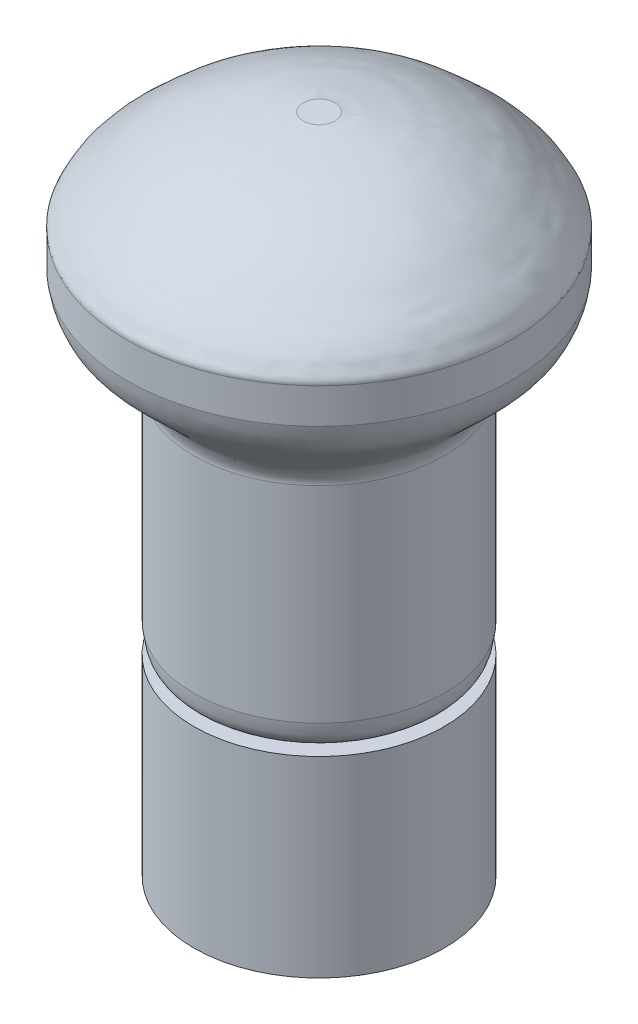
ISO-10303-21;
HEADER;
FILE_DESCRIPTION(('STEP AP214'),'2;1');
FILE_NAME('part.step','',(''),(''),'','','');
FILE_SCHEMA(('AUTOMOTIVE_DESIGN { 1 0 10303 214 1 1 1 1 }'));
ENDSEC;
DATA;
#1=APPLICATION_CONTEXT('core data for automotive mechanical design processes');
#2=APPLICATION_PROTOCOL_DEFINITION('international standard','automotive_design',2000,#1);
#3=PRODUCT_CONTEXT('',#1,'mechanical');
#4=PRODUCT('Part','Part','',(#3));
#5=PRODUCT_RELATED_PRODUCT_CATEGORY('part','',(#4));
#6=PRODUCT_DEFINITION_FORMATION('','',#4);
#7=PRODUCT_DEFINITION_CONTEXT('part definition',#1,'design');
#8=PRODUCT_DEFINITION('design','',#6,#7);
#9=PRODUCT_DEFINITION_SHAPE('','',#8);
#10=(LENGTH_UNIT() NAMED_UNIT(*) SI_UNIT(.MILLI.,.METRE.));
#11=(NAMED_UNIT(*) PLANE_ANGLE_UNIT() SI_UNIT($,.RADIAN.));
#12=(NAMED_UNIT(*) SI_UNIT($,.STERADIAN.) SOLID_ANGLE_UNIT());
#13=UNCERTAINTY_MEASURE_WITH_UNIT(LENGTH_MEASURE(1.E-05),#10,'distance_accuracy_value','');
#14=(GEOMETRIC_REPRESENTATION_CONTEXT(3) GLOBAL_UNCERTAINTY_ASSIGNED_CONTEXT((#13)) GLOBAL_UNIT_ASSIGNED_CONTEXT((#10,
#11,#12)) REPRESENTATION_CONTEXT('',''));
#15=CARTESIAN_POINT('',(0.,0.,0.));
#16=DIRECTION('',(0.,0.,1.));
#17=DIRECTION('',(1.,0.,0.));
#18=AXIS2_PLACEMENT_3D('',#15,#16,#17);
#19=CARTESIAN_POINT('',(0.,274.97797815188,-26.0877562004189));
#20=CARTESIAN_POINT('',(0.,275.85671053562,-26.008069584367));
#21=CARTESIAN_POINT('',(0.,277.028730659966,-26.4968306616538));
#22=CARTESIAN_POINT('',(0.,278.556908895579,-27.143781616818));
#23=CARTESIAN_POINT('',(0.,279.511909602148,-28.0566998106422));
#24=CARTESIAN_POINT('',(0.,280.515150439003,-28.8604144206132));
#25=CARTESIAN_POINT('',(0.,281.464372876021,-29.8741822057865));
#26=CARTESIAN_POINT('',(0.,282.438718877527,-30.7668156666122));
#27=CARTESIAN_POINT('',(0.,283.286750944215,-31.8701319484381));
#28=CARTESIAN_POINT('',(0.,284.296585872149,-32.8232553683531));
#29=CARTESIAN_POINT('',(0.,285.346264323249,-33.8310623741313));
#30=CARTESIAN_POINT('',(0.,286.251458488581,-34.9740473057541));
#31=CARTESIAN_POINT('',(0.,287.265101849722,-35.9232084666643));
#32=CARTESIAN_POINT('',(0.,288.227943295312,-36.9195004345893));
#33=CARTESIAN_POINT('',(0.,289.239215664027,-37.8417550182629));
#34=CARTESIAN_POINT('',(0.,290.459886772489,-38.6018552910868));
#35=CARTESIAN_POINT('',(0.,291.690071061629,-39.1094769201823));
#36=CARTESIAN_POINT('',(0.,293.368854610872,-39.7868935513682));
#37=CARTESIAN_POINT('',(0.,294.713139617419,-39.9635855751277));
#38=CARTESIAN_POINT('',(0.,295.618823673656,-40.1350010667897));
#39=B_SPLINE_CURVE_WITH_KNOTS('',3,(#19,#20,#21,#22,#23,#24,#25,#26,#27,#28,#29,#30,#31,#32,#33,
#34,#35,#36,#37,#38),.UNSPECIFIED.,.F.,.F.,(4,1,1,1,1,1,1,1,1,1,1,1,1,1,1,1,1,4),(0.,
0.098162731319244,0.148050319930377,0.191615525816055,0.250907111027677,0.298235650507006,
0.353450737835848,0.404874012400153,0.460091024302986,0.515307654342493,0.57460049280603,
0.629814130030781,0.677144600956594,0.736437803653506,0.789054863646636,0.843990098189885,
0.891644292334275,1.),.UNSPECIFIED.);
#40=CARTESIAN_POINT('',(0.,324.,1.29063426612674E-12));
#41=DIRECTION('',(0.,1.,0.));
#42=AXIS1_PLACEMENT('',#40,#41);
#43=SURFACE_OF_REVOLUTION('',#39,#42);
#44=CARTESIAN_POINT('',(0.,295.618823673656,1.28698734073051E-12));
#45=DIRECTION('',(0.,1.,0.));
#46=DIRECTION('',(0.,0.,1.));
#47=AXIS2_PLACEMENT_3D('',#44,#45,#46);
#48=CIRCLE('',#47,40.135001066791);
#49=CARTESIAN_POINT('',(0.,295.618823673656,40.1350010667923));
#50=VERTEX_POINT('',#49);
#51=EDGE_CURVE('E61',#50,#50,#48,.T.);
#52=ORIENTED_EDGE('',*,*,#51,.F.);
#53=EDGE_LOOP('',(#52));
#54=FACE_BOUND('',#53,.T.);
#55=CARTESIAN_POINT('',(0.,274.97797815188,1.28433503263491E-12));
#56=DIRECTION('',(0.,1.,0.));
#57=DIRECTION('',(0.,0.,1.));
#58=AXIS2_PLACEMENT_3D('',#55,#56,#57);
#59=CIRCLE('',#58,26.0877562004201);
#60=CARTESIAN_POINT('',(0.,274.97797815188,26.0877562004214));
#61=VERTEX_POINT('',#60);
#62=EDGE_CURVE('E10',#61,#61,#59,.T.);
#63=ORIENTED_EDGE('',*,*,#62,.T.);
#64=EDGE_LOOP('',(#63));
#65=FACE_BOUND('',#64,.T.);
#66=ADVANCED_FACE('F32',(#54,#65),#43,.T.);
#67=CARTESIAN_POINT('',(0.,324.,1.29063426612674E-12));
#68=DIRECTION('',(0.,1.,0.));
#69=DIRECTION('',(0.,0.,1.));
#70=AXIS2_PLACEMENT_3D('',#67,#68,#69);
#71=CYLINDRICAL_SURFACE('',#70,26.0877562004201);
#72=ORIENTED_EDGE('',*,*,#62,.F.);
#73=EDGE_LOOP('',(#72));
#74=FACE_BOUND('',#73,.T.);
#75=CARTESIAN_POINT('',(0.,232.119517882356,1.27882780469611E-12));
#76=DIRECTION('',(0.,1.,0.));
#77=DIRECTION('',(0.,0.,1.));
#78=AXIS2_PLACEMENT_3D('',#75,#76,#77);
#79=CIRCLE('',#78,26.0877562004201);
#80=CARTESIAN_POINT('',(0.,232.119517882356,26.0877562004213));
#81=VERTEX_POINT('',#80);
#82=EDGE_CURVE('E39',#81,#81,#79,.T.);
#83=ORIENTED_EDGE('',*,*,#82,.T.);
#84=EDGE_LOOP('',(#83));
#85=FACE_BOUND('',#84,.T.);
#86=ADVANCED_FACE('F79',(#74,#85),#71,.T.);
#87=CARTESIAN_POINT('',(0.,226.099267924578,-21.6442226380291));
#88=CARTESIAN_POINT('',(0.,226.150905548264,-21.9583507807492));
#89=CARTESIAN_POINT('',(0.,226.152975164436,-22.404904397741));
#90=CARTESIAN_POINT('',(0.,226.332084554161,-22.8959588216177));
#91=CARTESIAN_POINT('',(0.,226.749372055139,-23.4400307864732));
#92=CARTESIAN_POINT('',(0.,227.201358343078,-24.2443056301981));
#93=CARTESIAN_POINT('',(0.,227.972439802654,-25.006598671449));
#94=CARTESIAN_POINT('',(0.,228.952220984884,-25.5796050233695));
#95=CARTESIAN_POINT('',(0.,230.393042058328,-25.8622226042477));
#96=CARTESIAN_POINT('',(0.,231.443642051662,-26.0228206402817));
#97=CARTESIAN_POINT('',(0.,232.119517882356,-26.0877562004188));
#98=B_SPLINE_CURVE_WITH_KNOTS('',3,(#87,#88,#89,#90,#91,#92,#93,#94,#95,#96,#97),.UNSPECIFIED.,
.F.,.F.,(4,1,1,1,1,1,1,1,4),(0.,0.0919240044132616,0.112491347202395,0.205673427891337,
0.333713757734475,0.459267324426669,0.602422929602104,0.748839040688865,1.),.UNSPECIFIED.);
#99=CARTESIAN_POINT('',(0.,324.,1.29063426612674E-12));
#100=DIRECTION('',(0.,1.,0.));
#101=AXIS1_PLACEMENT('',#99,#100);
#102=SURFACE_OF_REVOLUTION('',#98,#101);
#103=ORIENTED_EDGE('',*,*,#82,.F.);
#104=EDGE_LOOP('',(#103));
#105=FACE_BOUND('',#104,.T.);
#106=CARTESIAN_POINT('',(0.,226.099267924578,1.27805421440478E-12));
#107=DIRECTION('',(0.,1.,0.));
#108=DIRECTION('',(0.,0.,1.));
#109=AXIS2_PLACEMENT_3D('',#106,#107,#108);
#110=CIRCLE('',#109,21.6442226380304);
#111=CARTESIAN_POINT('',(0.,226.099267924578,21.6442226380317));
#112=VERTEX_POINT('',#111);
#113=EDGE_CURVE('E43',#112,#112,#110,.T.);
#114=ORIENTED_EDGE('',*,*,#113,.T.);
#115=EDGE_LOOP('',(#114));
#116=FACE_BOUND('',#115,.T.);
#117=ADVANCED_FACE('F75',(#105,#116),#102,.T.);
#118=CARTESIAN_POINT('',(0.,226.099267924578,-21.6442226380291));
#119=DIRECTION('',(0.,-1.,0.));
#120=DIRECTION('',(0.,0.,-1.));
#121=AXIS2_PLACEMENT_3D('',#118,#119,#120);
#122=PLANE('',#121);
#123=ORIENTED_EDGE('',*,*,#113,.F.);
#124=EDGE_LOOP('',(#123));
#125=FACE_BOUND('',#124,.T.);
#126=CARTESIAN_POINT('',(0.,226.099267924578,1.27805421440478E-12));
#127=DIRECTION('',(0.,1.,0.));
#128=DIRECTION('',(0.,0.,1.));
#129=AXIS2_PLACEMENT_3D('',#126,#127,#128);
#130=CIRCLE('',#129,26.0877562004201);
#131=CARTESIAN_POINT('',(0.,226.099267924578,26.0877562004214));
#132=VERTEX_POINT('',#131);
#133=EDGE_CURVE('E47',#132,#132,#130,.T.);
#134=ORIENTED_EDGE('',*,*,#133,.T.);
#135=EDGE_LOOP('',(#134));
#136=FACE_BOUND('',#135,.T.);
#137=ADVANCED_FACE('F78',(#125,#136),#122,.F.);
#138=CARTESIAN_POINT('',(0.,324.,1.29063426612674E-12));
#139=DIRECTION('',(0.,1.,0.));
#140=DIRECTION('',(0.,0.,1.));
#141=AXIS2_PLACEMENT_3D('',#138,#139,#140);
#142=CYLINDRICAL_SURFACE('',#141,26.0877562004201);
#143=ORIENTED_EDGE('',*,*,#133,.F.);
#144=EDGE_LOOP('',(#143));
#145=FACE_BOUND('',#144,.T.);
#146=CARTESIAN_POINT('',(0.,186.115239509348,1.27291634531174E-12));
#147=DIRECTION('',(0.,1.,0.));
#148=DIRECTION('',(0.,0.,1.));
#149=AXIS2_PLACEMENT_3D('',#146,#147,#148);
#150=CIRCLE('',#149,26.0877562004202);
#151=CARTESIAN_POINT('',(0.,186.115239509348,26.0877562004215));
#152=VERTEX_POINT('',#151);
#153=EDGE_CURVE('E52',#152,#152,#150,.T.);
#154=ORIENTED_EDGE('',*,*,#153,.T.);
#155=EDGE_LOOP('',(#154));
#156=FACE_BOUND('',#155,.T.);
#157=ADVANCED_FACE('F110',(#145,#156),#142,.T.);
#158=CARTESIAN_POINT('',(0.,186.115239509348,-26.0877562004189));
#159=DIRECTION('',(0.,1.,0.));
#160=DIRECTION('',(0.,0.,1.));
#161=AXIS2_PLACEMENT_3D('',#158,#159,#160);
#162=PLANE('',#161);
#163=ORIENTED_EDGE('',*,*,#153,.F.);
#164=EDGE_LOOP('',(#163));
#165=FACE_BOUND('',#164,.T.);
#166=ADVANCED_FACE('F107',(#165),#162,.F.);
#167=CARTESIAN_POINT('',(0.,324.000000663065,1.29063426621195E-12));
#168=DIRECTION('',(0.,-1.,0.));
#169=DIRECTION('',(0.,0.,-1.));
#170=AXIS2_PLACEMENT_3D('',#167,#168,#169);
#171=PLANE('',#170);
#172=CARTESIAN_POINT('',(0.,324.00000132613,1.29063426629715E-12));
#173=DIRECTION('',(0.,1.,0.));
#174=DIRECTION('',(0.,0.,1.));
#175=AXIS2_PLACEMENT_3D('',#172,#173,#174);
#176=CIRCLE('',#175,3.29680710935418);
#177=CARTESIAN_POINT('',(0.,324.00000132613,3.29680710935547));
#178=VERTEX_POINT('',#177);
#179=EDGE_CURVE('E55',#178,#178,#176,.T.);
#180=ORIENTED_EDGE('',*,*,#179,.T.);
#181=EDGE_LOOP('',(#180));
#182=FACE_BOUND('',#181,.T.);
#183=ADVANCED_FACE('F100',(#182),#171,.F.);
#184=CARTESIAN_POINT('',(0.,302.929125624309,-40.1350010667897));
#185=CARTESIAN_POINT('',(0.,303.734041187309,-40.2773731158294));
#186=CARTESIAN_POINT('',(0.,304.634911320729,-39.472447783729));
#187=CARTESIAN_POINT('',(0.,306.096129676233,-38.9048173101565));
#188=CARTESIAN_POINT('',(0.,307.123784157933,-38.1232721170399));
#189=CARTESIAN_POINT('',(0.,308.020839773503,-37.2941898053905));
#190=CARTESIAN_POINT('',(0.,309.094911082276,-36.507817893929));
#191=CARTESIAN_POINT('',(0.,309.886673636216,-35.3895375288614));
#192=CARTESIAN_POINT('',(0.,310.964611829062,-34.4538834764471));
#193=CARTESIAN_POINT('',(0.,311.850348536143,-33.3377919178896));
#194=CARTESIAN_POINT('',(0.,312.858119022295,-32.1959384791973));
#195=CARTESIAN_POINT('',(0.,313.930025749134,-31.0579698322153));
#196=CARTESIAN_POINT('',(0.,314.893883423043,-29.732159343708));
#197=CARTESIAN_POINT('',(0.,315.783230305052,-28.4317929523757));
#198=CARTESIAN_POINT('',(0.,316.751797909452,-27.1065577612186));
#199=CARTESIAN_POINT('',(0.,317.351842670149,-25.6762035426409));
#200=CARTESIAN_POINT('',(0.,318.116319480558,-24.4370956134543));
#201=CARTESIAN_POINT('',(0.,318.685639731566,-23.2155889953771));
#202=CARTESIAN_POINT('',(0.,319.262699901517,-22.140955466625));
#203=CARTESIAN_POINT('',(0.,319.694847200565,-21.0685887714425));
#204=CARTESIAN_POINT('',(0.,320.193493736991,-19.9309751225669));
#205=CARTESIAN_POINT('',(0.,320.641634269685,-18.8379169628178));
#206=CARTESIAN_POINT('',(0.,321.014944924373,-17.7338670667982));
#207=CARTESIAN_POINT('',(0.,321.249118960795,-16.8100082151483));
#208=CARTESIAN_POINT('',(0.,321.566233217262,-15.9114961193784));
#209=CARTESIAN_POINT('',(0.,321.911666772491,-14.8643430011066));
#210=CARTESIAN_POINT('',(0.,322.313021033603,-13.6371518456722));
#211=CARTESIAN_POINT('',(0.,322.557718534826,-12.1816326643064));
#212=CARTESIAN_POINT('',(0.,322.853770709844,-10.7506907556199));
#213=CARTESIAN_POINT('',(0.,323.156322342493,-9.27221547863258));
#214=CARTESIAN_POINT('',(0.,323.429691692967,-7.69349690876678));
#215=CARTESIAN_POINT('',(0.,323.815957426679,-5.69903077234635));
#216=CARTESIAN_POINT('',(0.,323.839631010621,-4.19716953330026));
#217=CARTESIAN_POINT('',(0.,324.00000132613,-3.29680710935289));
#218=B_SPLINE_CURVE_WITH_KNOTS('',3,(#184,#185,#186,#187,#188,#189,#190,#191,#192,#193,#194,
#195,#196,#197,#198,#199,#200,#201,#202,#203,#204,#205,#206,#207,#208,#209,#210,#211,#212,#213,
#214,#215,#216,#217),.UNSPECIFIED.,.F.,.F.,(4,1,1,1,1,1,1,1,1,1,1,1,1,1,1,1,1,1,1,1,1,1,1,1,1,1,
1,1,1,1,1,4),(0.,0.0487759562585639,0.0776052481053953,0.105330341983679,0.135047076566176,
0.160217455939016,0.194481426274449,0.226388462837515,0.256102501737517,0.290364764351959,
0.329176232590418,0.361406883366528,0.400749846443287,0.435612620367223,0.471646405133775,
0.504831922599108,0.533660456723952,0.562486271670573,0.587035304192654,0.611577475715011,
0.646293700828938,0.666681105004421,0.69014175443044,0.710527470444541,0.730911710659771,
0.764562227724847,0.797431048522779,0.830299831268158,0.863169263467409,0.899205065983318,
0.938415133837604,1.),.UNSPECIFIED.);
#219=CARTESIAN_POINT('',(0.,324.,1.29063426612674E-12));
#220=DIRECTION('',(0.,1.,0.));
#221=AXIS1_PLACEMENT('',#219,#220);
#222=SURFACE_OF_REVOLUTION('',#218,#221);
#223=ORIENTED_EDGE('',*,*,#179,.F.);
#224=EDGE_LOOP('',(#223));
#225=FACE_BOUND('',#224,.T.);
#226=CARTESIAN_POINT('',(0.,302.929125624309,1.28792670016831E-12));
#227=DIRECTION('',(0.,1.,0.));
#228=DIRECTION('',(0.,0.,1.));
#229=AXIS2_PLACEMENT_3D('',#226,#227,#228);
#230=CIRCLE('',#229,40.135001066791);
#231=CARTESIAN_POINT('',(0.,302.929125624309,40.1350010667923));
#232=VERTEX_POINT('',#231);
#233=EDGE_CURVE('E58',#232,#232,#230,.T.);
#234=ORIENTED_EDGE('',*,*,#233,.T.);
#235=EDGE_LOOP('',(#234));
#236=FACE_BOUND('',#235,.T.);
#237=ADVANCED_FACE('F94',(#225,#236),#222,.T.);
#238=CARTESIAN_POINT('',(0.,324.,1.29063426612674E-12));
#239=DIRECTION('',(0.,1.,0.));
#240=DIRECTION('',(0.,0.,1.));
#241=AXIS2_PLACEMENT_3D('',#238,#239,#240);
#242=CYLINDRICAL_SURFACE('',#241,40.135001066791);
#243=ORIENTED_EDGE('',*,*,#233,.F.);
#244=EDGE_LOOP('',(#243));
#245=FACE_BOUND('',#244,.T.);
#246=ORIENTED_EDGE('',*,*,#51,.T.);
#247=EDGE_LOOP('',(#246));
#248=FACE_BOUND('',#247,.T.);
#249=ADVANCED_FACE('F92',(#245,#248),#242,.T.);
#250=CLOSED_SHELL('',(#66,#86,#117,#137,#157,#166,#183,#237,#249));
#251=MANIFOLD_SOLID_BREP('B2',#250);
#252=ADVANCED_BREP_SHAPE_REPRESENTATION('',(#18,#251),#14);
#253=SHAPE_DEFINITION_REPRESENTATION(#9,#252);
ENDSEC;
END-ISO-10303-21;
